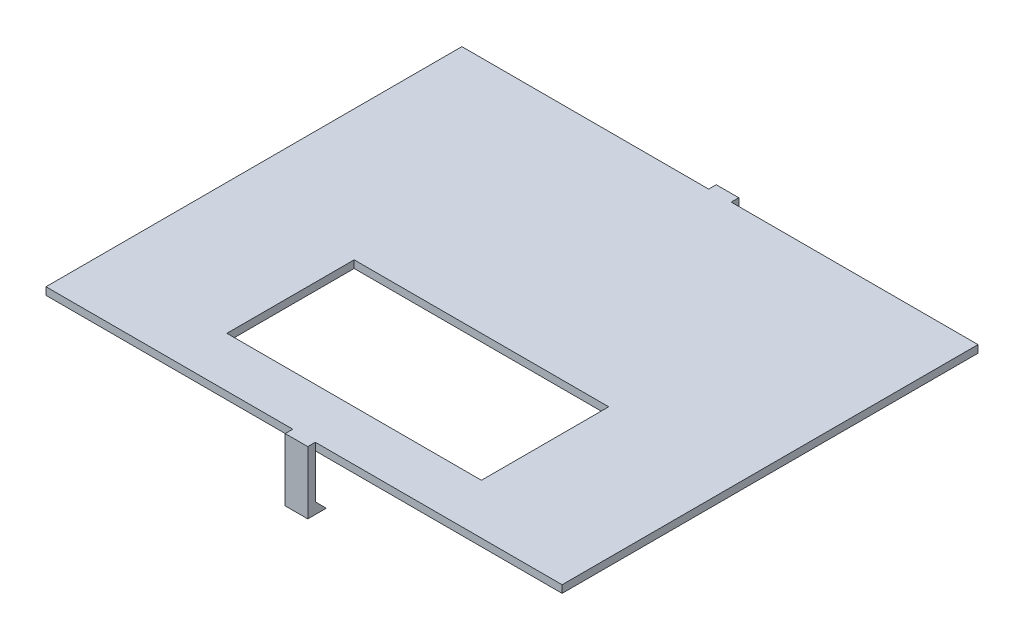
ISO-10303-21;
HEADER;
FILE_DESCRIPTION(('STEP AP214'),'2;1');
FILE_NAME('part.step','',(''),(''),'','','');
FILE_SCHEMA(('AUTOMOTIVE_DESIGN { 1 0 10303 214 1 1 1 1 }'));
ENDSEC;
DATA;
#1=APPLICATION_CONTEXT('core data for automotive mechanical design processes');
#2=APPLICATION_PROTOCOL_DEFINITION('international standard','automotive_design',2000,#1);
#3=PRODUCT_CONTEXT('',#1,'mechanical');
#4=PRODUCT('Part','Part','',(#3));
#5=PRODUCT_RELATED_PRODUCT_CATEGORY('part','',(#4));
#6=PRODUCT_DEFINITION_FORMATION('','',#4);
#7=PRODUCT_DEFINITION_CONTEXT('part definition',#1,'design');
#8=PRODUCT_DEFINITION('design','',#6,#7);
#9=PRODUCT_DEFINITION_SHAPE('','',#8);
#10=(LENGTH_UNIT() NAMED_UNIT(*) SI_UNIT(.MILLI.,.METRE.));
#11=(NAMED_UNIT(*) PLANE_ANGLE_UNIT() SI_UNIT($,.RADIAN.));
#12=(NAMED_UNIT(*) SI_UNIT($,.STERADIAN.) SOLID_ANGLE_UNIT());
#13=UNCERTAINTY_MEASURE_WITH_UNIT(LENGTH_MEASURE(1.E-05),#10,'distance_accuracy_value','');
#14=(GEOMETRIC_REPRESENTATION_CONTEXT(3) GLOBAL_UNCERTAINTY_ASSIGNED_CONTEXT((#13)) GLOBAL_UNIT_ASSIGNED_CONTEXT((#10,
#11,#12)) REPRESENTATION_CONTEXT('',''));
#15=CARTESIAN_POINT('',(0.,0.,0.));
#16=DIRECTION('',(0.,0.,1.));
#17=DIRECTION('',(1.,0.,0.));
#18=AXIS2_PLACEMENT_3D('',#15,#16,#17);
#19=CARTESIAN_POINT('',(-33.2076502732241,1.5,-29.4084699453552));
#20=DIRECTION('',(0.,0.,1.));
#21=DIRECTION('',(1.,0.,0.));
#22=AXIS2_PLACEMENT_3D('',#19,#20,#21);
#23=PLANE('',#22);
#24=DIRECTION('',(0.,-1.,0.));
#25=VECTOR('',#24,1.);
#26=CARTESIAN_POINT('',(20.5423497267759,0.,-29.4084699453552));
#27=LINE('',#26,#25);
#28=CARTESIAN_POINT('',(20.5423497267759,1.5,-29.4084699453552));
#29=VERTEX_POINT('',#28);
#30=CARTESIAN_POINT('',(20.5423497267759,0.,-29.4084699453552));
#31=VERTEX_POINT('',#30);
#32=EDGE_CURVE('E234',#29,#31,#27,.T.);
#33=ORIENTED_EDGE('',*,*,#32,.F.);
#34=DIRECTION('',(-1.,0.,0.));
#35=VECTOR('',#34,1.);
#36=CARTESIAN_POINT('',(-33.2076502732241,1.5,-29.4084699453552));
#37=LINE('',#36,#35);
#38=CARTESIAN_POINT('',(69.792349726776,1.5,-29.4084699453552));
#39=VERTEX_POINT('',#38);
#40=EDGE_CURVE('E325',#39,#29,#37,.T.);
#41=ORIENTED_EDGE('',*,*,#40,.F.);
#42=DIRECTION('',(0.,-1.,0.));
#43=VECTOR('',#42,1.);
#44=CARTESIAN_POINT('',(69.792349726776,1.5,-29.4084699453552));
#45=LINE('',#44,#43);
#46=CARTESIAN_POINT('',(69.792349726776,0.,-29.4084699453552));
#47=VERTEX_POINT('',#46);
#48=EDGE_CURVE('E340',#39,#47,#45,.T.);
#49=ORIENTED_EDGE('',*,*,#48,.T.);
#50=DIRECTION('',(-1.,0.,0.));
#51=VECTOR('',#50,1.);
#52=CARTESIAN_POINT('',(-33.2076502732241,0.,-29.4084699453552));
#53=LINE('',#52,#51);
#54=EDGE_CURVE('E318',#47,#31,#53,.T.);
#55=ORIENTED_EDGE('',*,*,#54,.T.);
#56=EDGE_LOOP('',(#33,#41,#49,#55));
#57=FACE_BOUND('',#56,.T.);
#58=ADVANCED_FACE('F33',(#57),#23,.F.);
#59=CARTESIAN_POINT('',(-33.207650273224,1.5,53.5915300546448));
#60=DIRECTION('',(0.,0.,-1.));
#61=DIRECTION('',(-1.,0.,0.));
#62=AXIS2_PLACEMENT_3D('',#59,#60,#61);
#63=PLANE('',#62);
#64=DIRECTION('',(0.,1.,0.));
#65=VECTOR('',#64,1.);
#66=CARTESIAN_POINT('',(16.042349726776,0.,53.5915300546448));
#67=LINE('',#66,#65);
#68=CARTESIAN_POINT('',(16.042349726776,0.,53.5915300546448));
#69=VERTEX_POINT('',#68);
#70=CARTESIAN_POINT('',(16.042349726776,1.5,53.5915300546448));
#71=VERTEX_POINT('',#70);
#72=EDGE_CURVE('E267',#69,#71,#67,.T.);
#73=ORIENTED_EDGE('',*,*,#72,.T.);
#74=DIRECTION('',(1.,0.,0.));
#75=VECTOR('',#74,1.);
#76=CARTESIAN_POINT('',(-33.207650273224,1.5,53.5915300546448));
#77=LINE('',#76,#75);
#78=CARTESIAN_POINT('',(-33.207650273224,1.5,53.5915300546448));
#79=VERTEX_POINT('',#78);
#80=EDGE_CURVE('E319',#79,#71,#77,.T.);
#81=ORIENTED_EDGE('',*,*,#80,.F.);
#82=DIRECTION('',(0.,-1.,0.));
#83=VECTOR('',#82,1.);
#84=CARTESIAN_POINT('',(-33.207650273224,1.5,53.5915300546448));
#85=LINE('',#84,#83);
#86=CARTESIAN_POINT('',(-33.207650273224,0.,53.5915300546448));
#87=VERTEX_POINT('',#86);
#88=EDGE_CURVE('E11',#79,#87,#85,.T.);
#89=ORIENTED_EDGE('',*,*,#88,.T.);
#90=DIRECTION('',(1.,0.,0.));
#91=VECTOR('',#90,1.);
#92=CARTESIAN_POINT('',(-33.207650273224,0.,53.5915300546448));
#93=LINE('',#92,#91);
#94=EDGE_CURVE('E332',#87,#69,#93,.T.);
#95=ORIENTED_EDGE('',*,*,#94,.T.);
#96=EDGE_LOOP('',(#73,#81,#89,#95));
#97=FACE_BOUND('',#96,.T.);
#98=ADVANCED_FACE('F383',(#97),#63,.F.);
#99=CARTESIAN_POINT('',(-33.2076502732241,1.5,-29.4084699453552));
#100=DIRECTION('',(1.,0.,0.));
#101=DIRECTION('',(0.,0.,-1.));
#102=AXIS2_PLACEMENT_3D('',#99,#100,#101);
#103=PLANE('',#102);
#104=DIRECTION('',(0.,0.,1.));
#105=VECTOR('',#104,1.);
#106=CARTESIAN_POINT('',(-33.2076502732241,0.,-29.4084699453552));
#107=LINE('',#106,#105);
#108=CARTESIAN_POINT('',(-33.2076502732241,0.,-29.4084699453552));
#109=VERTEX_POINT('',#108);
#110=EDGE_CURVE('E313',#109,#87,#107,.T.);
#111=ORIENTED_EDGE('',*,*,#110,.T.);
#112=ORIENTED_EDGE('',*,*,#88,.F.);
#113=DIRECTION('',(0.,0.,1.));
#114=VECTOR('',#113,1.);
#115=CARTESIAN_POINT('',(-33.2076502732241,1.5,-29.4084699453552));
#116=LINE('',#115,#114);
#117=CARTESIAN_POINT('',(-33.2076502732241,1.5,-29.4084699453552));
#118=VERTEX_POINT('',#117);
#119=EDGE_CURVE('E314',#118,#79,#116,.T.);
#120=ORIENTED_EDGE('',*,*,#119,.F.);
#121=DIRECTION('',(0.,-1.,0.));
#122=VECTOR('',#121,1.);
#123=CARTESIAN_POINT('',(-33.2076502732241,1.5,-29.4084699453552));
#124=LINE('',#123,#122);
#125=EDGE_CURVE('E328',#118,#109,#124,.T.);
#126=ORIENTED_EDGE('',*,*,#125,.T.);
#127=EDGE_LOOP('',(#111,#112,#120,#126));
#128=FACE_BOUND('',#127,.T.);
#129=ADVANCED_FACE('F35',(#128),#103,.F.);
#130=CARTESIAN_POINT('',(20.542349726776,1.5,53.5915300546448));
#131=VERTEX_POINT('',#130);
#132=CARTESIAN_POINT('',(69.792349726776,1.5,53.5915300546448));
#133=VERTEX_POINT('',#132);
#134=EDGE_CURVE('E317',#131,#133,#77,.T.);
#135=ORIENTED_EDGE('',*,*,#134,.F.);
#136=DIRECTION('',(0.,1.,0.));
#137=VECTOR('',#136,1.);
#138=CARTESIAN_POINT('',(20.542349726776,0.,53.5915300546448));
#139=LINE('',#138,#137);
#140=CARTESIAN_POINT('',(20.542349726776,0.,53.5915300546448));
#141=VERTEX_POINT('',#140);
#142=EDGE_CURVE('E268',#141,#131,#139,.T.);
#143=ORIENTED_EDGE('',*,*,#142,.F.);
#144=CARTESIAN_POINT('',(69.792349726776,0.,53.5915300546448));
#145=VERTEX_POINT('',#144);
#146=EDGE_CURVE('E331',#141,#145,#93,.T.);
#147=ORIENTED_EDGE('',*,*,#146,.T.);
#148=DIRECTION('',(0.,-1.,0.));
#149=VECTOR('',#148,1.);
#150=CARTESIAN_POINT('',(69.792349726776,1.5,53.5915300546448));
#151=LINE('',#150,#149);
#152=EDGE_CURVE('E41',#133,#145,#151,.T.);
#153=ORIENTED_EDGE('',*,*,#152,.F.);
#154=EDGE_LOOP('',(#135,#143,#147,#153));
#155=FACE_BOUND('',#154,.T.);
#156=ADVANCED_FACE('F368',(#155),#63,.F.);
#157=CARTESIAN_POINT('',(69.792349726776,1.5,-29.4084699453552));
#158=DIRECTION('',(-1.,0.,0.));
#159=DIRECTION('',(0.,0.,1.));
#160=AXIS2_PLACEMENT_3D('',#157,#158,#159);
#161=PLANE('',#160);
#162=DIRECTION('',(0.,0.,-1.));
#163=VECTOR('',#162,1.);
#164=CARTESIAN_POINT('',(69.792349726776,0.,-29.4084699453552));
#165=LINE('',#164,#163);
#166=EDGE_CURVE('E334',#145,#47,#165,.T.);
#167=ORIENTED_EDGE('',*,*,#166,.T.);
#168=ORIENTED_EDGE('',*,*,#48,.F.);
#169=DIRECTION('',(0.,0.,-1.));
#170=VECTOR('',#169,1.);
#171=CARTESIAN_POINT('',(69.792349726776,1.5,-29.4084699453552));
#172=LINE('',#171,#170);
#173=EDGE_CURVE('E322',#133,#39,#172,.T.);
#174=ORIENTED_EDGE('',*,*,#173,.F.);
#175=ORIENTED_EDGE('',*,*,#152,.T.);
#176=EDGE_LOOP('',(#167,#168,#174,#175));
#177=FACE_BOUND('',#176,.T.);
#178=ADVANCED_FACE('F347',(#177),#161,.F.);
#179=CARTESIAN_POINT('',(16.0423497267759,1.5,-29.4084699453552));
#180=VERTEX_POINT('',#179);
#181=EDGE_CURVE('E324',#180,#118,#37,.T.);
#182=ORIENTED_EDGE('',*,*,#181,.F.);
#183=DIRECTION('',(0.,-1.,0.));
#184=VECTOR('',#183,1.);
#185=CARTESIAN_POINT('',(16.0423497267759,0.,-29.4084699453552));
#186=LINE('',#185,#184);
#187=CARTESIAN_POINT('',(16.0423497267759,0.,-29.4084699453552));
#188=VERTEX_POINT('',#187);
#189=EDGE_CURVE('E223',#180,#188,#186,.T.);
#190=ORIENTED_EDGE('',*,*,#189,.T.);
#191=EDGE_CURVE('E336',#188,#109,#53,.T.);
#192=ORIENTED_EDGE('',*,*,#191,.T.);
#193=ORIENTED_EDGE('',*,*,#125,.F.);
#194=EDGE_LOOP('',(#182,#190,#192,#193));
#195=FACE_BOUND('',#194,.T.);
#196=ADVANCED_FACE('F391',(#195),#23,.F.);
#197=CARTESIAN_POINT('',(0.,1.5,0.));
#198=DIRECTION('',(0.,1.,0.));
#199=DIRECTION('',(0.,0.,1.));
#200=AXIS2_PLACEMENT_3D('',#197,#198,#199);
#201=PLANE('',#200);
#202=DIRECTION('',(0.,0.,1.));
#203=VECTOR('',#202,1.);
#204=CARTESIAN_POINT('',(-7.10765027322404,1.5,18.1915300546448));
#205=LINE('',#204,#203);
#206=CARTESIAN_POINT('',(-7.10765027322404,1.5,18.1915300546448));
#207=VERTEX_POINT('',#206);
#208=CARTESIAN_POINT('',(-7.10765027322404,1.5,43.5915300546448));
#209=VERTEX_POINT('',#208);
#210=EDGE_CURVE('E48',#207,#209,#205,.T.);
#211=ORIENTED_EDGE('',*,*,#210,.F.);
#212=DIRECTION('',(-1.,0.,0.));
#213=VECTOR('',#212,1.);
#214=CARTESIAN_POINT('',(-7.10765027322404,1.5,18.1915300546448));
#215=LINE('',#214,#213);
#216=CARTESIAN_POINT('',(43.692349726776,1.5,18.1915300546448));
#217=VERTEX_POINT('',#216);
#218=EDGE_CURVE('E200',#217,#207,#215,.T.);
#219=ORIENTED_EDGE('',*,*,#218,.F.);
#220=DIRECTION('',(0.,0.,-1.));
#221=VECTOR('',#220,1.);
#222=CARTESIAN_POINT('',(43.692349726776,1.5,18.1915300546448));
#223=LINE('',#222,#221);
#224=CARTESIAN_POINT('',(43.692349726776,1.5,43.5915300546448));
#225=VERTEX_POINT('',#224);
#226=EDGE_CURVE('E203',#225,#217,#223,.T.);
#227=ORIENTED_EDGE('',*,*,#226,.F.);
#228=DIRECTION('',(1.,0.,0.));
#229=VECTOR('',#228,1.);
#230=CARTESIAN_POINT('',(-7.10765027322404,1.5,43.5915300546448));
#231=LINE('',#230,#229);
#232=EDGE_CURVE('E209',#209,#225,#231,.T.);
#233=ORIENTED_EDGE('',*,*,#232,.F.);
#234=EDGE_LOOP('',(#211,#219,#227,#233));
#235=FACE_BOUND('',#234,.T.);
#236=ORIENTED_EDGE('',*,*,#119,.T.);
#237=ORIENTED_EDGE('',*,*,#80,.T.);
#238=DIRECTION('',(0.,0.,1.));
#239=VECTOR('',#238,1.);
#240=CARTESIAN_POINT('',(16.042349726776,1.5,53.5915300546448));
#241=LINE('',#240,#239);
#242=CARTESIAN_POINT('',(16.042349726776,1.5,55.1015300546448));
#243=VERTEX_POINT('',#242);
#244=EDGE_CURVE('E287',#71,#243,#241,.T.);
#245=ORIENTED_EDGE('',*,*,#244,.T.);
#246=DIRECTION('',(-1.,0.,0.));
#247=VECTOR('',#246,1.);
#248=CARTESIAN_POINT('',(20.542349726776,1.5,55.1015300546448));
#249=LINE('',#248,#247);
#250=CARTESIAN_POINT('',(20.542349726776,1.5,55.1015300546448));
#251=VERTEX_POINT('',#250);
#252=EDGE_CURVE('E310',#251,#243,#249,.T.);
#253=ORIENTED_EDGE('',*,*,#252,.F.);
#254=DIRECTION('',(0.,0.,1.));
#255=VECTOR('',#254,1.);
#256=CARTESIAN_POINT('',(20.542349726776,1.5,53.5915300546448));
#257=LINE('',#256,#255);
#258=EDGE_CURVE('E271',#131,#251,#257,.T.);
#259=ORIENTED_EDGE('',*,*,#258,.F.);
#260=ORIENTED_EDGE('',*,*,#134,.T.);
#261=ORIENTED_EDGE('',*,*,#173,.T.);
#262=ORIENTED_EDGE('',*,*,#40,.T.);
#263=DIRECTION('',(0.,0.,1.));
#264=VECTOR('',#263,1.);
#265=CARTESIAN_POINT('',(20.5423497267759,1.50000000000001,-29.4084699453552));
#266=LINE('',#265,#264);
#267=CARTESIAN_POINT('',(20.5423497267759,1.50000000000001,-30.9184699453552));
#268=VERTEX_POINT('',#267);
#269=EDGE_CURVE('E231',#268,#29,#266,.T.);
#270=ORIENTED_EDGE('',*,*,#269,.F.);
#271=DIRECTION('',(-1.,0.,0.));
#272=VECTOR('',#271,1.);
#273=CARTESIAN_POINT('',(20.5423497267759,1.50000000000001,-30.9184699453552));
#274=LINE('',#273,#272);
#275=CARTESIAN_POINT('',(16.0423497267759,1.50000000000001,-30.9184699453552));
#276=VERTEX_POINT('',#275);
#277=EDGE_CURVE('E237',#268,#276,#274,.T.);
#278=ORIENTED_EDGE('',*,*,#277,.T.);
#279=DIRECTION('',(0.,0.,1.));
#280=VECTOR('',#279,1.);
#281=CARTESIAN_POINT('',(16.0423497267759,1.50000000000001,-29.4084699453552));
#282=LINE('',#281,#280);
#283=EDGE_CURVE('E248',#276,#180,#282,.T.);
#284=ORIENTED_EDGE('',*,*,#283,.T.);
#285=ORIENTED_EDGE('',*,*,#181,.T.);
#286=EDGE_LOOP('',(#236,#237,#245,#253,#259,#260,#261,#262,#270,#278,#284,#285));
#287=FACE_BOUND('',#286,.T.);
#288=ADVANCED_FACE('F364',(#235,#287),#201,.T.);
#289=CARTESIAN_POINT('',(0.,0.,0.));
#290=DIRECTION('',(0.,1.,0.));
#291=DIRECTION('',(0.,0.,1.));
#292=AXIS2_PLACEMENT_3D('',#289,#290,#291);
#293=PLANE('',#292);
#294=DIRECTION('',(-1.,0.,0.));
#295=VECTOR('',#294,1.);
#296=CARTESIAN_POINT('',(-7.10765027322404,0.,18.1915300546448));
#297=LINE('',#296,#295);
#298=CARTESIAN_POINT('',(43.692349726776,0.,18.1915300546448));
#299=VERTEX_POINT('',#298);
#300=CARTESIAN_POINT('',(-7.10765027322404,0.,18.1915300546448));
#301=VERTEX_POINT('',#300);
#302=EDGE_CURVE('E190',#299,#301,#297,.T.);
#303=ORIENTED_EDGE('',*,*,#302,.T.);
#304=DIRECTION('',(0.,0.,1.));
#305=VECTOR('',#304,1.);
#306=CARTESIAN_POINT('',(-7.10765027322404,0.,18.1915300546448));
#307=LINE('',#306,#305);
#308=CARTESIAN_POINT('',(-7.10765027322404,0.,43.5915300546448));
#309=VERTEX_POINT('',#308);
#310=EDGE_CURVE('E184',#301,#309,#307,.T.);
#311=ORIENTED_EDGE('',*,*,#310,.T.);
#312=DIRECTION('',(1.,0.,0.));
#313=VECTOR('',#312,1.);
#314=CARTESIAN_POINT('',(-7.10765027322404,0.,43.5915300546448));
#315=LINE('',#314,#313);
#316=CARTESIAN_POINT('',(43.692349726776,0.,43.5915300546448));
#317=VERTEX_POINT('',#316);
#318=EDGE_CURVE('E193',#309,#317,#315,.T.);
#319=ORIENTED_EDGE('',*,*,#318,.T.);
#320=DIRECTION('',(0.,0.,-1.));
#321=VECTOR('',#320,1.);
#322=CARTESIAN_POINT('',(43.692349726776,0.,18.1915300546448));
#323=LINE('',#322,#321);
#324=EDGE_CURVE('E56',#317,#299,#323,.T.);
#325=ORIENTED_EDGE('',*,*,#324,.T.);
#326=EDGE_LOOP('',(#303,#311,#319,#325));
#327=FACE_BOUND('',#326,.T.);
#328=ORIENTED_EDGE('',*,*,#110,.F.);
#329=ORIENTED_EDGE('',*,*,#191,.F.);
#330=DIRECTION('',(0.,3.69719990010697E-13,-1.));
#331=VECTOR('',#330,1.);
#332=CARTESIAN_POINT('',(16.0423497267759,0.,-29.4184699453552));
#333=LINE('',#332,#331);
#334=CARTESIAN_POINT('',(16.0423497267759,0.,-29.4184699453552));
#335=VERTEX_POINT('',#334);
#336=EDGE_CURVE('E215',#188,#335,#333,.T.);
#337=ORIENTED_EDGE('',*,*,#336,.T.);
#338=DIRECTION('',(-1.,0.,0.));
#339=VECTOR('',#338,1.);
#340=CARTESIAN_POINT('',(20.5423497267759,0.,-29.4184699453552));
#341=LINE('',#340,#339);
#342=CARTESIAN_POINT('',(20.5423497267759,0.,-29.4184699453552));
#343=VERTEX_POINT('',#342);
#344=EDGE_CURVE('E264',#343,#335,#341,.T.);
#345=ORIENTED_EDGE('',*,*,#344,.F.);
#346=DIRECTION('',(0.,3.69719990010697E-13,-1.));
#347=VECTOR('',#346,1.);
#348=CARTESIAN_POINT('',(20.5423497267759,0.,-29.4184699453552));
#349=LINE('',#348,#347);
#350=EDGE_CURVE('E219',#31,#343,#349,.T.);
#351=ORIENTED_EDGE('',*,*,#350,.F.);
#352=ORIENTED_EDGE('',*,*,#54,.F.);
#353=ORIENTED_EDGE('',*,*,#166,.F.);
#354=ORIENTED_EDGE('',*,*,#146,.F.);
#355=DIRECTION('',(0.,0.,-1.));
#356=VECTOR('',#355,1.);
#357=CARTESIAN_POINT('',(20.542349726776,0.,53.6015300546448));
#358=LINE('',#357,#356);
#359=CARTESIAN_POINT('',(20.542349726776,0.,53.6015300546448));
#360=VERTEX_POINT('',#359);
#361=EDGE_CURVE('E282',#360,#141,#358,.T.);
#362=ORIENTED_EDGE('',*,*,#361,.F.);
#363=DIRECTION('',(-1.,0.,0.));
#364=VECTOR('',#363,1.);
#365=CARTESIAN_POINT('',(20.542349726776,0.,53.6015300546448));
#366=LINE('',#365,#364);
#367=CARTESIAN_POINT('',(16.042349726776,0.,53.6015300546448));
#368=VERTEX_POINT('',#367);
#369=EDGE_CURVE('E285',#360,#368,#366,.T.);
#370=ORIENTED_EDGE('',*,*,#369,.T.);
#371=DIRECTION('',(0.,0.,-1.));
#372=VECTOR('',#371,1.);
#373=CARTESIAN_POINT('',(16.042349726776,0.,53.6015300546448));
#374=LINE('',#373,#372);
#375=EDGE_CURVE('E272',#368,#69,#374,.T.);
#376=ORIENTED_EDGE('',*,*,#375,.T.);
#377=ORIENTED_EDGE('',*,*,#94,.F.);
#378=EDGE_LOOP('',(#328,#329,#337,#345,#351,#352,#353,#354,#362,#370,#376,#377));
#379=FACE_BOUND('',#378,.T.);
#380=ADVANCED_FACE('F197',(#327,#379),#293,.F.);
#381=CARTESIAN_POINT('',(20.542349726776,1.5,55.1015300546448));
#382=DIRECTION('',(0.,0.,-1.));
#383=DIRECTION('',(-1.,0.,0.));
#384=AXIS2_PLACEMENT_3D('',#381,#382,#383);
#385=PLANE('',#384);
#386=DIRECTION('',(0.,-1.,0.));
#387=VECTOR('',#386,1.);
#388=CARTESIAN_POINT('',(16.042349726776,1.5,55.1015300546448));
#389=LINE('',#388,#387);
#390=CARTESIAN_POINT('',(16.042349726776,-11.,55.1015300546448));
#391=VERTEX_POINT('',#390);
#392=EDGE_CURVE('E289',#243,#391,#389,.T.);
#393=ORIENTED_EDGE('',*,*,#392,.T.);
#394=DIRECTION('',(-1.,0.,0.));
#395=VECTOR('',#394,1.);
#396=CARTESIAN_POINT('',(20.542349726776,-11.,55.1015300546448));
#397=LINE('',#396,#395);
#398=CARTESIAN_POINT('',(20.542349726776,-11.,55.1015300546448));
#399=VERTEX_POINT('',#398);
#400=EDGE_CURVE('E307',#399,#391,#397,.T.);
#401=ORIENTED_EDGE('',*,*,#400,.F.);
#402=DIRECTION('',(0.,-1.,0.));
#403=VECTOR('',#402,1.);
#404=CARTESIAN_POINT('',(20.542349726776,1.5,55.1015300546448));
#405=LINE('',#404,#403);
#406=EDGE_CURVE('E274',#251,#399,#405,.T.);
#407=ORIENTED_EDGE('',*,*,#406,.F.);
#408=ORIENTED_EDGE('',*,*,#252,.T.);
#409=EDGE_LOOP('',(#393,#401,#407,#408));
#410=FACE_BOUND('',#409,.T.);
#411=ADVANCED_FACE('F463',(#410),#385,.F.);
#412=CARTESIAN_POINT('',(20.542349726776,-11.,55.1015300546448));
#413=DIRECTION('',(0.,1.,0.));
#414=DIRECTION('',(0.,0.,1.));
#415=AXIS2_PLACEMENT_3D('',#412,#413,#414);
#416=PLANE('',#415);
#417=DIRECTION('',(0.,0.,-1.));
#418=VECTOR('',#417,1.);
#419=CARTESIAN_POINT('',(16.042349726776,-11.,55.1015300546448));
#420=LINE('',#419,#418);
#421=CARTESIAN_POINT('',(16.042349726776,-11.,51.3953568973428));
#422=VERTEX_POINT('',#421);
#423=EDGE_CURVE('E291',#391,#422,#420,.T.);
#424=ORIENTED_EDGE('',*,*,#423,.T.);
#425=DIRECTION('',(-1.,0.,0.));
#426=VECTOR('',#425,1.);
#427=CARTESIAN_POINT('',(20.542349726776,-11.,51.3953568973428));
#428=LINE('',#427,#426);
#429=CARTESIAN_POINT('',(20.542349726776,-11.,51.3953568973428));
#430=VERTEX_POINT('',#429);
#431=EDGE_CURVE('E304',#430,#422,#428,.T.);
#432=ORIENTED_EDGE('',*,*,#431,.F.);
#433=DIRECTION('',(0.,0.,-1.));
#434=VECTOR('',#433,1.);
#435=CARTESIAN_POINT('',(20.542349726776,-11.,55.1015300546448));
#436=LINE('',#435,#434);
#437=EDGE_CURVE('E276',#399,#430,#436,.T.);
#438=ORIENTED_EDGE('',*,*,#437,.F.);
#439=ORIENTED_EDGE('',*,*,#400,.T.);
#440=EDGE_LOOP('',(#424,#432,#438,#439));
#441=FACE_BOUND('',#440,.T.);
#442=ADVANCED_FACE('F468',(#441),#416,.F.);
#443=CARTESIAN_POINT('',(20.542349726776,-11.,51.3953568973428));
#444=DIRECTION('',(0.,-0.707106781186551,0.707106781186544));
#445=DIRECTION('',(0.,-0.707106781186544,-0.707106781186551));
#446=AXIS2_PLACEMENT_3D('',#443,#444,#445);
#447=PLANE('',#446);
#448=DIRECTION('',(0.,0.707106781186544,0.707106781186551));
#449=VECTOR('',#448,1.);
#450=CARTESIAN_POINT('',(16.042349726776,-11.,51.3953568973428));
#451=LINE('',#450,#449);
#452=CARTESIAN_POINT('',(16.042349726776,-8.79382684269798,53.6015300546448));
#453=VERTEX_POINT('',#452);
#454=EDGE_CURVE('E293',#422,#453,#451,.T.);
#455=ORIENTED_EDGE('',*,*,#454,.T.);
#456=DIRECTION('',(-1.,0.,0.));
#457=VECTOR('',#456,1.);
#458=CARTESIAN_POINT('',(20.542349726776,-8.79382684269798,53.6015300546448));
#459=LINE('',#458,#457);
#460=CARTESIAN_POINT('',(20.542349726776,-8.79382684269798,53.6015300546448));
#461=VERTEX_POINT('',#460);
#462=EDGE_CURVE('E301',#461,#453,#459,.T.);
#463=ORIENTED_EDGE('',*,*,#462,.F.);
#464=DIRECTION('',(0.,0.707106781186544,0.707106781186551));
#465=VECTOR('',#464,1.);
#466=CARTESIAN_POINT('',(20.542349726776,-11.,51.3953568973428));
#467=LINE('',#466,#465);
#468=EDGE_CURVE('E278',#430,#461,#467,.T.);
#469=ORIENTED_EDGE('',*,*,#468,.F.);
#470=ORIENTED_EDGE('',*,*,#431,.T.);
#471=EDGE_LOOP('',(#455,#463,#469,#470));
#472=FACE_BOUND('',#471,.T.);
#473=ADVANCED_FACE('F480',(#472),#447,.F.);
#474=CARTESIAN_POINT('',(20.542349726776,-8.79382684269798,53.6015300546448));
#475=DIRECTION('',(0.,0.,1.));
#476=DIRECTION('',(1.,0.,0.));
#477=AXIS2_PLACEMENT_3D('',#474,#475,#476);
#478=PLANE('',#477);
#479=DIRECTION('',(0.,1.,0.));
#480=VECTOR('',#479,1.);
#481=CARTESIAN_POINT('',(16.042349726776,-8.79382684269798,53.6015300546448));
#482=LINE('',#481,#480);
#483=EDGE_CURVE('E295',#453,#368,#482,.T.);
#484=ORIENTED_EDGE('',*,*,#483,.T.);
#485=ORIENTED_EDGE('',*,*,#369,.F.);
#486=DIRECTION('',(0.,1.,0.));
#487=VECTOR('',#486,1.);
#488=CARTESIAN_POINT('',(20.542349726776,-8.79382684269798,53.6015300546448));
#489=LINE('',#488,#487);
#490=EDGE_CURVE('E280',#461,#360,#489,.T.);
#491=ORIENTED_EDGE('',*,*,#490,.F.);
#492=ORIENTED_EDGE('',*,*,#462,.T.);
#493=EDGE_LOOP('',(#484,#485,#491,#492));
#494=FACE_BOUND('',#493,.T.);
#495=ADVANCED_FACE('F490',(#494),#478,.F.);
#496=CARTESIAN_POINT('',(20.542349726776,0.,0.));
#497=DIRECTION('',(1.,0.,0.));
#498=DIRECTION('',(0.,0.,-1.));
#499=AXIS2_PLACEMENT_3D('',#496,#497,#498);
#500=PLANE('',#499);
#501=ORIENTED_EDGE('',*,*,#142,.T.);
#502=ORIENTED_EDGE('',*,*,#258,.T.);
#503=ORIENTED_EDGE('',*,*,#406,.T.);
#504=ORIENTED_EDGE('',*,*,#437,.T.);
#505=ORIENTED_EDGE('',*,*,#468,.T.);
#506=ORIENTED_EDGE('',*,*,#490,.T.);
#507=ORIENTED_EDGE('',*,*,#361,.T.);
#508=EDGE_LOOP('',(#501,#502,#503,#504,#505,#506,#507));
#509=FACE_BOUND('',#508,.T.);
#510=ADVANCED_FACE('F370',(#509),#500,.T.);
#511=CARTESIAN_POINT('',(16.042349726776,0.,0.));
#512=DIRECTION('',(1.,0.,0.));
#513=DIRECTION('',(0.,0.,-1.));
#514=AXIS2_PLACEMENT_3D('',#511,#512,#513);
#515=PLANE('',#514);
#516=ORIENTED_EDGE('',*,*,#72,.F.);
#517=ORIENTED_EDGE('',*,*,#375,.F.);
#518=ORIENTED_EDGE('',*,*,#483,.F.);
#519=ORIENTED_EDGE('',*,*,#454,.F.);
#520=ORIENTED_EDGE('',*,*,#423,.F.);
#521=ORIENTED_EDGE('',*,*,#392,.F.);
#522=ORIENTED_EDGE('',*,*,#244,.F.);
#523=EDGE_LOOP('',(#516,#517,#518,#519,#520,#521,#522));
#524=FACE_BOUND('',#523,.T.);
#525=ADVANCED_FACE('F378',(#524),#515,.F.);
#526=CARTESIAN_POINT('',(20.5423497267759,-8.79382684269797,-29.4184699453552));
#527=DIRECTION('',(0.,0.,-1.));
#528=DIRECTION('',(-1.,0.,0.));
#529=AXIS2_PLACEMENT_3D('',#526,#527,#528);
#530=PLANE('',#529);
#531=DIRECTION('',(0.,-1.,0.));
#532=VECTOR('',#531,1.);
#533=CARTESIAN_POINT('',(16.0423497267759,-8.79382684269797,-29.4184699453552));
#534=LINE('',#533,#532);
#535=CARTESIAN_POINT('',(16.0423497267759,-8.79382684269797,-29.4184699453552));
#536=VERTEX_POINT('',#535);
#537=EDGE_CURVE('E240',#335,#536,#534,.T.);
#538=ORIENTED_EDGE('',*,*,#537,.T.);
#539=DIRECTION('',(-1.,0.,0.));
#540=VECTOR('',#539,1.);
#541=CARTESIAN_POINT('',(20.5423497267759,-8.79382684269797,-29.4184699453552));
#542=LINE('',#541,#540);
#543=CARTESIAN_POINT('',(20.5423497267759,-8.79382684269797,-29.4184699453552));
#544=VERTEX_POINT('',#543);
#545=EDGE_CURVE('E261',#544,#536,#542,.T.);
#546=ORIENTED_EDGE('',*,*,#545,.F.);
#547=DIRECTION('',(0.,-1.,0.));
#548=VECTOR('',#547,1.);
#549=CARTESIAN_POINT('',(20.5423497267759,-8.79382684269797,-29.4184699453552));
#550=LINE('',#549,#548);
#551=EDGE_CURVE('E222',#343,#544,#550,.T.);
#552=ORIENTED_EDGE('',*,*,#551,.F.);
#553=ORIENTED_EDGE('',*,*,#344,.T.);
#554=EDGE_LOOP('',(#538,#546,#552,#553));
#555=FACE_BOUND('',#554,.T.);
#556=ADVANCED_FACE('F398',(#555),#530,.F.);
#557=CARTESIAN_POINT('',(20.5423497267759,-11.,-27.2122967880531));
#558=DIRECTION('',(0.,-0.707106781186551,-0.707106781186544));
#559=DIRECTION('',(0.,0.707106781186544,-0.707106781186551));
#560=AXIS2_PLACEMENT_3D('',#557,#558,#559);
#561=PLANE('',#560);
#562=DIRECTION('',(0.,-0.707106781186544,0.707106781186551));
#563=VECTOR('',#562,1.);
#564=CARTESIAN_POINT('',(16.0423497267759,-11.,-27.2122967880531));
#565=LINE('',#564,#563);
#566=CARTESIAN_POINT('',(16.0423497267759,-11.,-27.2122967880531));
#567=VERTEX_POINT('',#566);
#568=EDGE_CURVE('E242',#536,#567,#565,.T.);
#569=ORIENTED_EDGE('',*,*,#568,.T.);
#570=DIRECTION('',(-1.,0.,0.));
#571=VECTOR('',#570,1.);
#572=CARTESIAN_POINT('',(20.5423497267759,-11.,-27.2122967880531));
#573=LINE('',#572,#571);
#574=CARTESIAN_POINT('',(20.5423497267759,-11.,-27.2122967880531));
#575=VERTEX_POINT('',#574);
#576=EDGE_CURVE('E258',#575,#567,#573,.T.);
#577=ORIENTED_EDGE('',*,*,#576,.F.);
#578=DIRECTION('',(0.,-0.707106781186544,0.707106781186551));
#579=VECTOR('',#578,1.);
#580=CARTESIAN_POINT('',(20.5423497267759,-11.,-27.2122967880531));
#581=LINE('',#580,#579);
#582=EDGE_CURVE('E225',#544,#575,#581,.T.);
#583=ORIENTED_EDGE('',*,*,#582,.F.);
#584=ORIENTED_EDGE('',*,*,#545,.T.);
#585=EDGE_LOOP('',(#569,#577,#583,#584));
#586=FACE_BOUND('',#585,.T.);
#587=ADVANCED_FACE('F404',(#586),#561,.F.);
#588=CARTESIAN_POINT('',(20.5423497267759,-11.,-30.9184699453552));
#589=DIRECTION('',(0.,1.,0.));
#590=DIRECTION('',(0.,0.,1.));
#591=AXIS2_PLACEMENT_3D('',#588,#589,#590);
#592=PLANE('',#591);
#593=DIRECTION('',(0.,0.,-1.));
#594=VECTOR('',#593,1.);
#595=CARTESIAN_POINT('',(16.0423497267759,-11.,-30.9184699453552));
#596=LINE('',#595,#594);
#597=CARTESIAN_POINT('',(16.0423497267759,-11.,-30.9184699453552));
#598=VERTEX_POINT('',#597);
#599=EDGE_CURVE('E244',#567,#598,#596,.T.);
#600=ORIENTED_EDGE('',*,*,#599,.T.);
#601=DIRECTION('',(-1.,0.,0.));
#602=VECTOR('',#601,1.);
#603=CARTESIAN_POINT('',(20.5423497267759,-11.,-30.9184699453552));
#604=LINE('',#603,#602);
#605=CARTESIAN_POINT('',(20.5423497267759,-11.,-30.9184699453552));
#606=VERTEX_POINT('',#605);
#607=EDGE_CURVE('E255',#606,#598,#604,.T.);
#608=ORIENTED_EDGE('',*,*,#607,.F.);
#609=DIRECTION('',(0.,0.,-1.));
#610=VECTOR('',#609,1.);
#611=CARTESIAN_POINT('',(20.5423497267759,-11.,-30.9184699453552));
#612=LINE('',#611,#610);
#613=EDGE_CURVE('E227',#575,#606,#612,.T.);
#614=ORIENTED_EDGE('',*,*,#613,.F.);
#615=ORIENTED_EDGE('',*,*,#576,.T.);
#616=EDGE_LOOP('',(#600,#608,#614,#615));
#617=FACE_BOUND('',#616,.T.);
#618=ADVANCED_FACE('F406',(#617),#592,.F.);
#619=CARTESIAN_POINT('',(20.5423497267759,1.50000000000001,-30.9184699453552));
#620=DIRECTION('',(0.,0.,1.));
#621=DIRECTION('',(1.,0.,0.));
#622=AXIS2_PLACEMENT_3D('',#619,#620,#621);
#623=PLANE('',#622);
#624=DIRECTION('',(0.,1.,0.));
#625=VECTOR('',#624,1.);
#626=CARTESIAN_POINT('',(16.0423497267759,1.50000000000001,-30.9184699453552));
#627=LINE('',#626,#625);
#628=EDGE_CURVE('E246',#598,#276,#627,.T.);
#629=ORIENTED_EDGE('',*,*,#628,.T.);
#630=ORIENTED_EDGE('',*,*,#277,.F.);
#631=DIRECTION('',(0.,1.,0.));
#632=VECTOR('',#631,1.);
#633=CARTESIAN_POINT('',(20.5423497267759,1.50000000000001,-30.9184699453552));
#634=LINE('',#633,#632);
#635=EDGE_CURVE('E229',#606,#268,#634,.T.);
#636=ORIENTED_EDGE('',*,*,#635,.F.);
#637=ORIENTED_EDGE('',*,*,#607,.T.);
#638=EDGE_LOOP('',(#629,#630,#636,#637));
#639=FACE_BOUND('',#638,.T.);
#640=ADVANCED_FACE('F409',(#639),#623,.F.);
#641=CARTESIAN_POINT('',(20.5423497267759,0.,0.));
#642=DIRECTION('',(-1.,0.,0.));
#643=DIRECTION('',(0.,0.,1.));
#644=AXIS2_PLACEMENT_3D('',#641,#642,#643);
#645=PLANE('',#644);
#646=ORIENTED_EDGE('',*,*,#350,.T.);
#647=ORIENTED_EDGE('',*,*,#551,.T.);
#648=ORIENTED_EDGE('',*,*,#582,.T.);
#649=ORIENTED_EDGE('',*,*,#613,.T.);
#650=ORIENTED_EDGE('',*,*,#635,.T.);
#651=ORIENTED_EDGE('',*,*,#269,.T.);
#652=ORIENTED_EDGE('',*,*,#32,.T.);
#653=EDGE_LOOP('',(#646,#647,#648,#649,#650,#651,#652));
#654=FACE_BOUND('',#653,.T.);
#655=ADVANCED_FACE('F359',(#654),#645,.F.);
#656=CARTESIAN_POINT('',(16.0423497267759,0.,0.));
#657=DIRECTION('',(-1.,0.,0.));
#658=DIRECTION('',(0.,0.,1.));
#659=AXIS2_PLACEMENT_3D('',#656,#657,#658);
#660=PLANE('',#659);
#661=ORIENTED_EDGE('',*,*,#336,.F.);
#662=ORIENTED_EDGE('',*,*,#189,.F.);
#663=ORIENTED_EDGE('',*,*,#283,.F.);
#664=ORIENTED_EDGE('',*,*,#628,.F.);
#665=ORIENTED_EDGE('',*,*,#599,.F.);
#666=ORIENTED_EDGE('',*,*,#568,.F.);
#667=ORIENTED_EDGE('',*,*,#537,.F.);
#668=EDGE_LOOP('',(#661,#662,#663,#664,#665,#666,#667));
#669=FACE_BOUND('',#668,.T.);
#670=ADVANCED_FACE('F393',(#669),#660,.T.);
#671=CARTESIAN_POINT('',(-7.10765027322404,0.,18.1915300546448));
#672=DIRECTION('',(-1.,0.,0.));
#673=DIRECTION('',(0.,0.,1.));
#674=AXIS2_PLACEMENT_3D('',#671,#672,#673);
#675=PLANE('',#674);
#676=ORIENTED_EDGE('',*,*,#210,.T.);
#677=DIRECTION('',(0.,1.,0.));
#678=VECTOR('',#677,1.);
#679=CARTESIAN_POINT('',(-7.10765027322404,0.,43.5915300546448));
#680=LINE('',#679,#678);
#681=EDGE_CURVE('E180',#309,#209,#680,.T.);
#682=ORIENTED_EDGE('',*,*,#681,.F.);
#683=ORIENTED_EDGE('',*,*,#310,.F.);
#684=DIRECTION('',(0.,1.,0.));
#685=VECTOR('',#684,1.);
#686=CARTESIAN_POINT('',(-7.10765027322404,0.,18.1915300546448));
#687=LINE('',#686,#685);
#688=EDGE_CURVE('E213',#301,#207,#687,.T.);
#689=ORIENTED_EDGE('',*,*,#688,.T.);
#690=EDGE_LOOP('',(#676,#682,#683,#689));
#691=FACE_BOUND('',#690,.T.);
#692=ADVANCED_FACE('F182',(#691),#675,.F.);
#693=CARTESIAN_POINT('',(-7.10765027322404,0.,18.1915300546448));
#694=DIRECTION('',(0.,0.,-1.));
#695=DIRECTION('',(-1.,0.,0.));
#696=AXIS2_PLACEMENT_3D('',#693,#694,#695);
#697=PLANE('',#696);
#698=ORIENTED_EDGE('',*,*,#218,.T.);
#699=ORIENTED_EDGE('',*,*,#688,.F.);
#700=ORIENTED_EDGE('',*,*,#302,.F.);
#701=DIRECTION('',(0.,1.,0.));
#702=VECTOR('',#701,1.);
#703=CARTESIAN_POINT('',(43.692349726776,0.,18.1915300546448));
#704=LINE('',#703,#702);
#705=EDGE_CURVE('E216',#299,#217,#704,.T.);
#706=ORIENTED_EDGE('',*,*,#705,.T.);
#707=EDGE_LOOP('',(#698,#699,#700,#706));
#708=FACE_BOUND('',#707,.T.);
#709=ADVANCED_FACE('F576',(#708),#697,.F.);
#710=CARTESIAN_POINT('',(43.692349726776,0.,18.1915300546448));
#711=DIRECTION('',(1.,0.,0.));
#712=DIRECTION('',(0.,0.,-1.));
#713=AXIS2_PLACEMENT_3D('',#710,#711,#712);
#714=PLANE('',#713);
#715=ORIENTED_EDGE('',*,*,#226,.T.);
#716=ORIENTED_EDGE('',*,*,#705,.F.);
#717=ORIENTED_EDGE('',*,*,#324,.F.);
#718=DIRECTION('',(0.,1.,0.));
#719=VECTOR('',#718,1.);
#720=CARTESIAN_POINT('',(43.692349726776,0.,43.5915300546448));
#721=LINE('',#720,#719);
#722=EDGE_CURVE('E189',#317,#225,#721,.T.);
#723=ORIENTED_EDGE('',*,*,#722,.T.);
#724=EDGE_LOOP('',(#715,#716,#717,#723));
#725=FACE_BOUND('',#724,.T.);
#726=ADVANCED_FACE('F585',(#725),#714,.F.);
#727=CARTESIAN_POINT('',(-7.10765027322404,0.,43.5915300546448));
#728=DIRECTION('',(0.,0.,1.));
#729=DIRECTION('',(1.,0.,0.));
#730=AXIS2_PLACEMENT_3D('',#727,#728,#729);
#731=PLANE('',#730);
#732=ORIENTED_EDGE('',*,*,#232,.T.);
#733=ORIENTED_EDGE('',*,*,#722,.F.);
#734=ORIENTED_EDGE('',*,*,#318,.F.);
#735=ORIENTED_EDGE('',*,*,#681,.T.);
#736=EDGE_LOOP('',(#732,#733,#734,#735));
#737=FACE_BOUND('',#736,.T.);
#738=ADVANCED_FACE('F194',(#737),#731,.F.);
#739=CLOSED_SHELL('',(#58,#98,#129,#156,#178,#196,#288,#380,#411,#442,#473,#495,#510,#525,#556,
#587,#618,#640,#655,#670,#692,#709,#726,#738));
#740=MANIFOLD_SOLID_BREP('B2',#739);
#741=ADVANCED_BREP_SHAPE_REPRESENTATION('',(#18,#740),#14);
#742=SHAPE_DEFINITION_REPRESENTATION(#9,#741);
ENDSEC;
END-ISO-10303-21;
